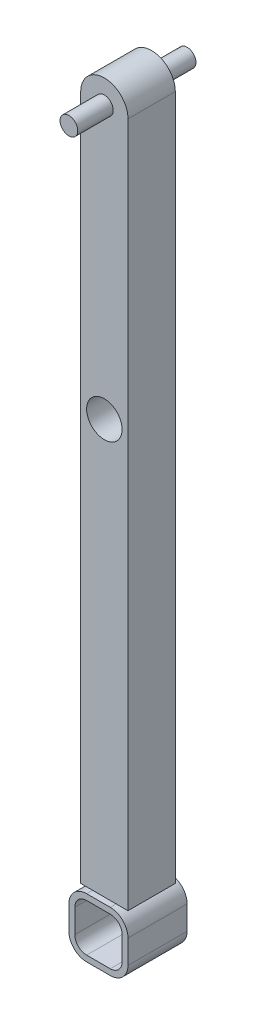
ISO-10303-21;
HEADER;
FILE_DESCRIPTION(('STEP AP214'),'2;1');
FILE_NAME('part.step','',(''),(''),'','','');
FILE_SCHEMA(('AUTOMOTIVE_DESIGN { 1 0 10303 214 1 1 1 1 }'));
ENDSEC;
DATA;
#1=APPLICATION_CONTEXT('core data for automotive mechanical design processes');
#2=APPLICATION_PROTOCOL_DEFINITION('international standard','automotive_design',2000,#1);
#3=PRODUCT_CONTEXT('',#1,'mechanical');
#4=PRODUCT('Part','Part','',(#3));
#5=PRODUCT_RELATED_PRODUCT_CATEGORY('part','',(#4));
#6=PRODUCT_DEFINITION_FORMATION('','',#4);
#7=PRODUCT_DEFINITION_CONTEXT('part definition',#1,'design');
#8=PRODUCT_DEFINITION('design','',#6,#7);
#9=PRODUCT_DEFINITION_SHAPE('','',#8);
#10=(LENGTH_UNIT() NAMED_UNIT(*) SI_UNIT(.MILLI.,.METRE.));
#11=(NAMED_UNIT(*) PLANE_ANGLE_UNIT() SI_UNIT($,.RADIAN.));
#12=(NAMED_UNIT(*) SI_UNIT($,.STERADIAN.) SOLID_ANGLE_UNIT());
#13=UNCERTAINTY_MEASURE_WITH_UNIT(LENGTH_MEASURE(1.E-05),#10,'distance_accuracy_value','');
#14=(GEOMETRIC_REPRESENTATION_CONTEXT(3) GLOBAL_UNCERTAINTY_ASSIGNED_CONTEXT((#13)) GLOBAL_UNIT_ASSIGNED_CONTEXT((#10,
#11,#12)) REPRESENTATION_CONTEXT('',''));
#15=CARTESIAN_POINT('',(0.,0.,0.));
#16=DIRECTION('',(0.,0.,1.));
#17=DIRECTION('',(1.,0.,0.));
#18=AXIS2_PLACEMENT_3D('',#15,#16,#17);
#19=CARTESIAN_POINT('',(0.,605.,5.00000000000001));
#20=DIRECTION('',(0.,0.,-1.));
#21=DIRECTION('',(-1.,0.,0.));
#22=AXIS2_PLACEMENT_3D('',#19,#20,#21);
#23=CYLINDRICAL_SURFACE('',#22,20.);
#24=DIRECTION('',(0.,0.,1.));
#25=VECTOR('',#24,1.);
#26=CARTESIAN_POINT('',(20.,605.,5.));
#27=LINE('',#26,#25);
#28=CARTESIAN_POINT('',(20.,605.,5.));
#29=VERTEX_POINT('',#28);
#30=CARTESIAN_POINT('',(20.,605.,45.));
#31=VERTEX_POINT('',#30);
#32=EDGE_CURVE('E354',#29,#31,#27,.T.);
#33=ORIENTED_EDGE('',*,*,#32,.F.);
#34=CARTESIAN_POINT('',(0.,605.,5.));
#35=DIRECTION('',(0.,0.,1.));
#36=DIRECTION('',(1.,0.,0.));
#37=AXIS2_PLACEMENT_3D('',#34,#35,#36);
#38=CIRCLE('',#37,20.);
#39=CARTESIAN_POINT('',(-20.,605.,5.));
#40=VERTEX_POINT('',#39);
#41=EDGE_CURVE('E52',#40,#29,#38,.F.);
#42=ORIENTED_EDGE('',*,*,#41,.F.);
#43=DIRECTION('',(0.,0.,1.));
#44=VECTOR('',#43,1.);
#45=CARTESIAN_POINT('',(-20.,605.,5.00000000000001));
#46=LINE('',#45,#44);
#47=CARTESIAN_POINT('',(-20.,605.,45.));
#48=VERTEX_POINT('',#47);
#49=EDGE_CURVE('E356',#48,#40,#46,.F.);
#50=ORIENTED_EDGE('',*,*,#49,.F.);
#51=CARTESIAN_POINT('',(0.,605.,45.));
#52=DIRECTION('',(0.,0.,-1.));
#53=DIRECTION('',(-1.,0.,0.));
#54=AXIS2_PLACEMENT_3D('',#51,#52,#53);
#55=CIRCLE('',#54,20.);
#56=EDGE_CURVE('E45',#31,#48,#55,.F.);
#57=ORIENTED_EDGE('',*,*,#56,.F.);
#58=EDGE_LOOP('',(#33,#42,#50,#57));
#59=FACE_BOUND('',#58,.T.);
#60=ADVANCED_FACE('F37',(#59),#23,.T.);
#61=CARTESIAN_POINT('',(-9.99999999999993,25.,50.));
#62=DIRECTION('',(0.,-1.,0.));
#63=DIRECTION('',(0.,0.,-1.));
#64=AXIS2_PLACEMENT_3D('',#61,#62,#63);
#65=PLANE('',#64);
#66=DIRECTION('',(-1.,0.,0.));
#67=VECTOR('',#66,1.);
#68=CARTESIAN_POINT('',(-9.99999999999993,25.,5.));
#69=LINE('',#68,#67);
#70=CARTESIAN_POINT('',(9.99999999999993,25.,5.));
#71=VERTEX_POINT('',#70);
#72=CARTESIAN_POINT('',(-9.99999999999993,25.,5.));
#73=VERTEX_POINT('',#72);
#74=EDGE_CURVE('E352',#71,#73,#69,.T.);
#75=ORIENTED_EDGE('',*,*,#74,.F.);
#76=DIRECTION('',(0.,0.,-1.));
#77=VECTOR('',#76,1.);
#78=CARTESIAN_POINT('',(9.99999999999993,25.,50.));
#79=LINE('',#78,#77);
#80=CARTESIAN_POINT('',(9.99999999999993,25.,0.));
#81=VERTEX_POINT('',#80);
#82=EDGE_CURVE('E327',#71,#81,#79,.T.);
#83=ORIENTED_EDGE('',*,*,#82,.T.);
#84=DIRECTION('',(-1.,0.,0.));
#85=VECTOR('',#84,1.);
#86=CARTESIAN_POINT('',(-9.99999999999993,25.,0.));
#87=LINE('',#86,#85);
#88=CARTESIAN_POINT('',(-9.99999999999993,25.,0.));
#89=VERTEX_POINT('',#88);
#90=EDGE_CURVE('E292',#81,#89,#87,.T.);
#91=ORIENTED_EDGE('',*,*,#90,.T.);
#92=DIRECTION('',(0.,0.,-1.));
#93=VECTOR('',#92,1.);
#94=CARTESIAN_POINT('',(-9.99999999999993,25.,50.));
#95=LINE('',#94,#93);
#96=EDGE_CURVE('E306',#73,#89,#95,.T.);
#97=ORIENTED_EDGE('',*,*,#96,.F.);
#98=EDGE_LOOP('',(#75,#83,#91,#97));
#99=FACE_BOUND('',#98,.T.);
#100=ADVANCED_FACE('F389',(#99),#65,.F.);
#101=DIRECTION('',(1.,0.,0.));
#102=VECTOR('',#101,1.);
#103=CARTESIAN_POINT('',(-9.99999999999993,25.,45.));
#104=LINE('',#103,#102);
#105=CARTESIAN_POINT('',(-9.99999999999993,25.,45.));
#106=VERTEX_POINT('',#105);
#107=CARTESIAN_POINT('',(9.99999999999993,25.,45.));
#108=VERTEX_POINT('',#107);
#109=EDGE_CURVE('E349',#106,#108,#104,.T.);
#110=ORIENTED_EDGE('',*,*,#109,.F.);
#111=CARTESIAN_POINT('',(-9.99999999999993,25.,50.));
#112=VERTEX_POINT('',#111);
#113=EDGE_CURVE('E324',#112,#106,#95,.T.);
#114=ORIENTED_EDGE('',*,*,#113,.F.);
#115=DIRECTION('',(-1.,0.,0.));
#116=VECTOR('',#115,1.);
#117=CARTESIAN_POINT('',(-9.99999999999993,25.,50.));
#118=LINE('',#117,#116);
#119=CARTESIAN_POINT('',(9.99999999999993,25.,50.));
#120=VERTEX_POINT('',#119);
#121=EDGE_CURVE('E304',#120,#112,#118,.T.);
#122=ORIENTED_EDGE('',*,*,#121,.F.);
#123=EDGE_CURVE('E329',#120,#108,#79,.T.);
#124=ORIENTED_EDGE('',*,*,#123,.T.);
#125=EDGE_LOOP('',(#110,#114,#122,#124));
#126=FACE_BOUND('',#125,.T.);
#127=ADVANCED_FACE('F371',(#126),#65,.F.);
#128=CARTESIAN_POINT('',(-10.,10.,50.));
#129=DIRECTION('',(0.,0.,1.));
#130=DIRECTION('',(1.,0.,0.));
#131=AXIS2_PLACEMENT_3D('',#128,#129,#130);
#132=PLANE('',#131);
#133=CARTESIAN_POINT('',(-10.,10.,50.));
#134=DIRECTION('',(0.,0.,1.));
#135=DIRECTION('',(1.,0.,0.));
#136=AXIS2_PLACEMENT_3D('',#133,#134,#135);
#137=CIRCLE('',#136,15.);
#138=CARTESIAN_POINT('',(-25.,9.99999999999993,50.));
#139=VERTEX_POINT('',#138);
#140=EDGE_CURVE('E288',#112,#139,#137,.T.);
#141=ORIENTED_EDGE('',*,*,#140,.T.);
#142=DIRECTION('',(0.,-1.,0.));
#143=VECTOR('',#142,1.);
#144=CARTESIAN_POINT('',(-25.,9.99999999999993,50.));
#145=LINE('',#144,#143);
#146=CARTESIAN_POINT('',(-25.,-9.9999999999999,50.));
#147=VERTEX_POINT('',#146);
#148=EDGE_CURVE('E291',#139,#147,#145,.T.);
#149=ORIENTED_EDGE('',*,*,#148,.T.);
#150=CARTESIAN_POINT('',(-10.,-10.,50.));
#151=DIRECTION('',(0.,0.,1.));
#152=DIRECTION('',(1.,0.,0.));
#153=AXIS2_PLACEMENT_3D('',#150,#151,#152);
#154=CIRCLE('',#153,15.);
#155=CARTESIAN_POINT('',(-9.99999999999993,-25.,50.));
#156=VERTEX_POINT('',#155);
#157=EDGE_CURVE('E294',#147,#156,#154,.T.);
#158=ORIENTED_EDGE('',*,*,#157,.T.);
#159=DIRECTION('',(1.,0.,0.));
#160=VECTOR('',#159,1.);
#161=CARTESIAN_POINT('',(-9.99999999999993,-25.,50.));
#162=LINE('',#161,#160);
#163=CARTESIAN_POINT('',(9.9999999999999,-25.,50.));
#164=VERTEX_POINT('',#163);
#165=EDGE_CURVE('E296',#156,#164,#162,.T.);
#166=ORIENTED_EDGE('',*,*,#165,.T.);
#167=CARTESIAN_POINT('',(10.,-10.,50.));
#168=DIRECTION('',(0.,0.,1.));
#169=DIRECTION('',(1.,0.,0.));
#170=AXIS2_PLACEMENT_3D('',#167,#168,#169);
#171=CIRCLE('',#170,15.);
#172=CARTESIAN_POINT('',(25.,-9.99999999999993,50.));
#173=VERTEX_POINT('',#172);
#174=EDGE_CURVE('E298',#164,#173,#171,.T.);
#175=ORIENTED_EDGE('',*,*,#174,.T.);
#176=DIRECTION('',(0.,1.,0.));
#177=VECTOR('',#176,1.);
#178=CARTESIAN_POINT('',(25.,9.99999999999989,50.));
#179=LINE('',#178,#177);
#180=CARTESIAN_POINT('',(25.,9.9999999999999,50.));
#181=VERTEX_POINT('',#180);
#182=EDGE_CURVE('E300',#173,#181,#179,.T.);
#183=ORIENTED_EDGE('',*,*,#182,.T.);
#184=CARTESIAN_POINT('',(10.,10.,50.));
#185=DIRECTION('',(0.,0.,1.));
#186=DIRECTION('',(-1.,0.,0.));
#187=AXIS2_PLACEMENT_3D('',#184,#185,#186);
#188=CIRCLE('',#187,15.);
#189=EDGE_CURVE('E302',#181,#120,#188,.T.);
#190=ORIENTED_EDGE('',*,*,#189,.T.);
#191=ORIENTED_EDGE('',*,*,#121,.T.);
#192=EDGE_LOOP('',(#141,#149,#158,#166,#175,#183,#190,#191));
#193=FACE_BOUND('',#192,.T.);
#194=DIRECTION('',(1.,0.,0.));
#195=VECTOR('',#194,1.);
#196=CARTESIAN_POINT('',(-9.99999999999993,-20.,50.));
#197=LINE('',#196,#195);
#198=CARTESIAN_POINT('',(-9.99999999999993,-20.,50.));
#199=VERTEX_POINT('',#198);
#200=CARTESIAN_POINT('',(9.99999999999994,-20.,50.));
#201=VERTEX_POINT('',#200);
#202=EDGE_CURVE('E231',#199,#201,#197,.T.);
#203=ORIENTED_EDGE('',*,*,#202,.F.);
#204=CARTESIAN_POINT('',(-10.,-10.,50.));
#205=DIRECTION('',(0.,0.,1.));
#206=DIRECTION('',(1.,0.,0.));
#207=AXIS2_PLACEMENT_3D('',#204,#205,#206);
#208=CIRCLE('',#207,10.);
#209=CARTESIAN_POINT('',(-20.,-9.99999999999993,50.));
#210=VERTEX_POINT('',#209);
#211=EDGE_CURVE('E229',#210,#199,#208,.T.);
#212=ORIENTED_EDGE('',*,*,#211,.F.);
#213=DIRECTION('',(0.,-1.,0.));
#214=VECTOR('',#213,1.);
#215=CARTESIAN_POINT('',(-20.,9.99999999999993,50.));
#216=LINE('',#215,#214);
#217=CARTESIAN_POINT('',(-20.,9.99999999999993,50.));
#218=VERTEX_POINT('',#217);
#219=EDGE_CURVE('E245',#218,#210,#216,.T.);
#220=ORIENTED_EDGE('',*,*,#219,.F.);
#221=CARTESIAN_POINT('',(-10.,10.,50.));
#222=DIRECTION('',(0.,0.,1.));
#223=DIRECTION('',(1.,0.,0.));
#224=AXIS2_PLACEMENT_3D('',#221,#222,#223);
#225=CIRCLE('',#224,10.);
#226=CARTESIAN_POINT('',(-9.99999999999993,20.,50.));
#227=VERTEX_POINT('',#226);
#228=EDGE_CURVE('E242',#227,#218,#225,.T.);
#229=ORIENTED_EDGE('',*,*,#228,.F.);
#230=DIRECTION('',(-1.,0.,0.));
#231=VECTOR('',#230,1.);
#232=CARTESIAN_POINT('',(-9.99999999999993,20.,50.));
#233=LINE('',#232,#231);
#234=CARTESIAN_POINT('',(9.99999999999993,20.,50.));
#235=VERTEX_POINT('',#234);
#236=EDGE_CURVE('E240',#235,#227,#233,.T.);
#237=ORIENTED_EDGE('',*,*,#236,.F.);
#238=CARTESIAN_POINT('',(10.,10.,50.));
#239=DIRECTION('',(0.,0.,1.));
#240=DIRECTION('',(-1.,0.,0.));
#241=AXIS2_PLACEMENT_3D('',#238,#239,#240);
#242=CIRCLE('',#241,10.);
#243=CARTESIAN_POINT('',(20.,9.99999999999993,50.));
#244=VERTEX_POINT('',#243);
#245=EDGE_CURVE('E238',#244,#235,#242,.T.);
#246=ORIENTED_EDGE('',*,*,#245,.F.);
#247=DIRECTION('',(0.,1.,0.));
#248=VECTOR('',#247,1.);
#249=CARTESIAN_POINT('',(20.,9.99999999999993,50.));
#250=LINE('',#249,#248);
#251=CARTESIAN_POINT('',(20.,-9.99999999999993,50.));
#252=VERTEX_POINT('',#251);
#253=EDGE_CURVE('E236',#252,#244,#250,.T.);
#254=ORIENTED_EDGE('',*,*,#253,.F.);
#255=CARTESIAN_POINT('',(10.,-10.,50.));
#256=DIRECTION('',(0.,0.,1.));
#257=DIRECTION('',(1.,0.,0.));
#258=AXIS2_PLACEMENT_3D('',#255,#256,#257);
#259=CIRCLE('',#258,10.);
#260=EDGE_CURVE('E234',#201,#252,#259,.T.);
#261=ORIENTED_EDGE('',*,*,#260,.F.);
#262=EDGE_LOOP('',(#203,#212,#220,#229,#237,#246,#254,#261));
#263=FACE_BOUND('',#262,.T.);
#264=ADVANCED_FACE('F379',(#193,#263),#132,.T.);
#265=CARTESIAN_POINT('',(-10.,10.,0.));
#266=DIRECTION('',(0.,0.,1.));
#267=DIRECTION('',(1.,0.,0.));
#268=AXIS2_PLACEMENT_3D('',#265,#266,#267);
#269=PLANE('',#268);
#270=CARTESIAN_POINT('',(-10.,10.,0.));
#271=DIRECTION('',(0.,0.,1.));
#272=DIRECTION('',(1.,0.,0.));
#273=AXIS2_PLACEMENT_3D('',#270,#271,#272);
#274=CIRCLE('',#273,15.);
#275=CARTESIAN_POINT('',(-25.,9.99999999999993,0.));
#276=VERTEX_POINT('',#275);
#277=EDGE_CURVE('E287',#89,#276,#274,.T.);
#278=ORIENTED_EDGE('',*,*,#277,.F.);
#279=ORIENTED_EDGE('',*,*,#90,.F.);
#280=CARTESIAN_POINT('',(10.,10.,0.));
#281=DIRECTION('',(0.,0.,1.));
#282=DIRECTION('',(-1.,0.,0.));
#283=AXIS2_PLACEMENT_3D('',#280,#281,#282);
#284=CIRCLE('',#283,15.);
#285=CARTESIAN_POINT('',(25.,9.9999999999999,0.));
#286=VERTEX_POINT('',#285);
#287=EDGE_CURVE('E319',#286,#81,#284,.T.);
#288=ORIENTED_EDGE('',*,*,#287,.F.);
#289=DIRECTION('',(0.,1.,0.));
#290=VECTOR('',#289,1.);
#291=CARTESIAN_POINT('',(25.,9.99999999999989,0.));
#292=LINE('',#291,#290);
#293=CARTESIAN_POINT('',(25.,-9.99999999999993,0.));
#294=VERTEX_POINT('',#293);
#295=EDGE_CURVE('E317',#294,#286,#292,.T.);
#296=ORIENTED_EDGE('',*,*,#295,.F.);
#297=CARTESIAN_POINT('',(10.,-10.,0.));
#298=DIRECTION('',(0.,0.,1.));
#299=DIRECTION('',(1.,0.,0.));
#300=AXIS2_PLACEMENT_3D('',#297,#298,#299);
#301=CIRCLE('',#300,15.);
#302=CARTESIAN_POINT('',(9.9999999999999,-25.,0.));
#303=VERTEX_POINT('',#302);
#304=EDGE_CURVE('E315',#303,#294,#301,.T.);
#305=ORIENTED_EDGE('',*,*,#304,.F.);
#306=DIRECTION('',(1.,0.,0.));
#307=VECTOR('',#306,1.);
#308=CARTESIAN_POINT('',(-9.99999999999993,-25.,0.));
#309=LINE('',#308,#307);
#310=CARTESIAN_POINT('',(-9.99999999999993,-25.,0.));
#311=VERTEX_POINT('',#310);
#312=EDGE_CURVE('E313',#311,#303,#309,.T.);
#313=ORIENTED_EDGE('',*,*,#312,.F.);
#314=CARTESIAN_POINT('',(-10.,-10.,0.));
#315=DIRECTION('',(0.,0.,1.));
#316=DIRECTION('',(1.,0.,0.));
#317=AXIS2_PLACEMENT_3D('',#314,#315,#316);
#318=CIRCLE('',#317,15.);
#319=CARTESIAN_POINT('',(-25.,-9.9999999999999,0.));
#320=VERTEX_POINT('',#319);
#321=EDGE_CURVE('E311',#320,#311,#318,.T.);
#322=ORIENTED_EDGE('',*,*,#321,.F.);
#323=DIRECTION('',(0.,-1.,0.));
#324=VECTOR('',#323,1.);
#325=CARTESIAN_POINT('',(-25.,9.99999999999993,0.));
#326=LINE('',#325,#324);
#327=EDGE_CURVE('E309',#276,#320,#326,.T.);
#328=ORIENTED_EDGE('',*,*,#327,.F.);
#329=EDGE_LOOP('',(#278,#279,#288,#296,#305,#313,#322,#328));
#330=FACE_BOUND('',#329,.T.);
#331=CARTESIAN_POINT('',(-10.,-10.,0.));
#332=DIRECTION('',(0.,0.,1.));
#333=DIRECTION('',(1.,0.,0.));
#334=AXIS2_PLACEMENT_3D('',#331,#332,#333);
#335=CIRCLE('',#334,10.);
#336=CARTESIAN_POINT('',(-20.,-9.99999999999993,0.));
#337=VERTEX_POINT('',#336);
#338=CARTESIAN_POINT('',(-9.99999999999993,-20.,0.));
#339=VERTEX_POINT('',#338);
#340=EDGE_CURVE('E194',#337,#339,#335,.T.);
#341=ORIENTED_EDGE('',*,*,#340,.T.);
#342=DIRECTION('',(1.,0.,0.));
#343=VECTOR('',#342,1.);
#344=CARTESIAN_POINT('',(-9.99999999999993,-20.,0.));
#345=LINE('',#344,#343);
#346=CARTESIAN_POINT('',(9.99999999999994,-20.,0.));
#347=VERTEX_POINT('',#346);
#348=EDGE_CURVE('E250',#339,#347,#345,.T.);
#349=ORIENTED_EDGE('',*,*,#348,.T.);
#350=CARTESIAN_POINT('',(10.,-10.,0.));
#351=DIRECTION('',(0.,0.,1.));
#352=DIRECTION('',(1.,0.,0.));
#353=AXIS2_PLACEMENT_3D('',#350,#351,#352);
#354=CIRCLE('',#353,10.);
#355=CARTESIAN_POINT('',(20.,-9.99999999999993,0.));
#356=VERTEX_POINT('',#355);
#357=EDGE_CURVE('E253',#347,#356,#354,.T.);
#358=ORIENTED_EDGE('',*,*,#357,.T.);
#359=DIRECTION('',(0.,1.,0.));
#360=VECTOR('',#359,1.);
#361=CARTESIAN_POINT('',(20.,9.99999999999993,0.));
#362=LINE('',#361,#360);
#363=CARTESIAN_POINT('',(20.,9.99999999999993,0.));
#364=VERTEX_POINT('',#363);
#365=EDGE_CURVE('E256',#356,#364,#362,.T.);
#366=ORIENTED_EDGE('',*,*,#365,.T.);
#367=CARTESIAN_POINT('',(10.,10.,0.));
#368=DIRECTION('',(0.,0.,1.));
#369=DIRECTION('',(-1.,0.,0.));
#370=AXIS2_PLACEMENT_3D('',#367,#368,#369);
#371=CIRCLE('',#370,10.);
#372=CARTESIAN_POINT('',(9.99999999999993,20.,0.));
#373=VERTEX_POINT('',#372);
#374=EDGE_CURVE('E259',#364,#373,#371,.T.);
#375=ORIENTED_EDGE('',*,*,#374,.T.);
#376=DIRECTION('',(-1.,0.,0.));
#377=VECTOR('',#376,1.);
#378=CARTESIAN_POINT('',(-9.99999999999993,20.,0.));
#379=LINE('',#378,#377);
#380=CARTESIAN_POINT('',(-9.99999999999993,20.,0.));
#381=VERTEX_POINT('',#380);
#382=EDGE_CURVE('E262',#373,#381,#379,.T.);
#383=ORIENTED_EDGE('',*,*,#382,.T.);
#384=CARTESIAN_POINT('',(-10.,10.,0.));
#385=DIRECTION('',(0.,0.,1.));
#386=DIRECTION('',(1.,0.,0.));
#387=AXIS2_PLACEMENT_3D('',#384,#385,#386);
#388=CIRCLE('',#387,10.);
#389=CARTESIAN_POINT('',(-20.,9.99999999999993,0.));
#390=VERTEX_POINT('',#389);
#391=EDGE_CURVE('E265',#381,#390,#388,.T.);
#392=ORIENTED_EDGE('',*,*,#391,.T.);
#393=DIRECTION('',(0.,-1.,0.));
#394=VECTOR('',#393,1.);
#395=CARTESIAN_POINT('',(-20.,9.99999999999993,0.));
#396=LINE('',#395,#394);
#397=EDGE_CURVE('E232',#390,#337,#396,.T.);
#398=ORIENTED_EDGE('',*,*,#397,.T.);
#399=EDGE_LOOP('',(#341,#349,#358,#366,#375,#383,#392,#398));
#400=FACE_BOUND('',#399,.T.);
#401=ADVANCED_FACE('F395',(#330,#400),#269,.F.);
#402=CARTESIAN_POINT('',(-10.,10.,50.));
#403=DIRECTION('',(0.,0.,-1.));
#404=DIRECTION('',(-1.,0.,0.));
#405=AXIS2_PLACEMENT_3D('',#402,#403,#404);
#406=CYLINDRICAL_SURFACE('',#405,15.);
#407=ORIENTED_EDGE('',*,*,#277,.T.);
#408=DIRECTION('',(0.,0.,-1.));
#409=VECTOR('',#408,1.);
#410=CARTESIAN_POINT('',(-25.,9.99999999999993,50.));
#411=LINE('',#410,#409);
#412=EDGE_CURVE('E346',#139,#276,#411,.T.);
#413=ORIENTED_EDGE('',*,*,#412,.F.);
#414=ORIENTED_EDGE('',*,*,#140,.F.);
#415=ORIENTED_EDGE('',*,*,#113,.T.);
#416=EDGE_CURVE('E328',#106,#73,#95,.T.);
#417=ORIENTED_EDGE('',*,*,#416,.T.);
#418=ORIENTED_EDGE('',*,*,#96,.T.);
#419=EDGE_LOOP('',(#407,#413,#414,#415,#417,#418));
#420=FACE_BOUND('',#419,.T.);
#421=ADVANCED_FACE('F376',(#420),#406,.T.);
#422=CARTESIAN_POINT('',(-25.,9.99999999999993,50.));
#423=DIRECTION('',(1.,0.,0.));
#424=DIRECTION('',(0.,1.,0.));
#425=AXIS2_PLACEMENT_3D('',#422,#423,#424);
#426=PLANE('',#425);
#427=ORIENTED_EDGE('',*,*,#327,.T.);
#428=DIRECTION('',(0.,0.,-1.));
#429=VECTOR('',#428,1.);
#430=CARTESIAN_POINT('',(-25.,-9.9999999999999,50.));
#431=LINE('',#430,#429);
#432=EDGE_CURVE('E343',#147,#320,#431,.T.);
#433=ORIENTED_EDGE('',*,*,#432,.F.);
#434=ORIENTED_EDGE('',*,*,#148,.F.);
#435=ORIENTED_EDGE('',*,*,#412,.T.);
#436=EDGE_LOOP('',(#427,#433,#434,#435));
#437=FACE_BOUND('',#436,.T.);
#438=ADVANCED_FACE('F400',(#437),#426,.F.);
#439=CARTESIAN_POINT('',(-10.,-10.,50.));
#440=DIRECTION('',(0.,0.,-1.));
#441=DIRECTION('',(-1.,0.,0.));
#442=AXIS2_PLACEMENT_3D('',#439,#440,#441);
#443=CYLINDRICAL_SURFACE('',#442,15.);
#444=ORIENTED_EDGE('',*,*,#321,.T.);
#445=DIRECTION('',(0.,0.,-1.));
#446=VECTOR('',#445,1.);
#447=CARTESIAN_POINT('',(-9.99999999999993,-25.,50.));
#448=LINE('',#447,#446);
#449=EDGE_CURVE('E340',#156,#311,#448,.T.);
#450=ORIENTED_EDGE('',*,*,#449,.F.);
#451=ORIENTED_EDGE('',*,*,#157,.F.);
#452=ORIENTED_EDGE('',*,*,#432,.T.);
#453=EDGE_LOOP('',(#444,#450,#451,#452));
#454=FACE_BOUND('',#453,.T.);
#455=ADVANCED_FACE('F404',(#454),#443,.T.);
#456=CARTESIAN_POINT('',(-9.99999999999993,-25.,50.));
#457=DIRECTION('',(0.,1.,0.));
#458=DIRECTION('',(-1.,0.,0.));
#459=AXIS2_PLACEMENT_3D('',#456,#457,#458);
#460=PLANE('',#459);
#461=ORIENTED_EDGE('',*,*,#312,.T.);
#462=DIRECTION('',(0.,0.,-1.));
#463=VECTOR('',#462,1.);
#464=CARTESIAN_POINT('',(9.9999999999999,-25.,50.));
#465=LINE('',#464,#463);
#466=EDGE_CURVE('E337',#164,#303,#465,.T.);
#467=ORIENTED_EDGE('',*,*,#466,.F.);
#468=ORIENTED_EDGE('',*,*,#165,.F.);
#469=ORIENTED_EDGE('',*,*,#449,.T.);
#470=EDGE_LOOP('',(#461,#467,#468,#469));
#471=FACE_BOUND('',#470,.T.);
#472=ADVANCED_FACE('F410',(#471),#460,.F.);
#473=CARTESIAN_POINT('',(10.,-10.,50.));
#474=DIRECTION('',(0.,0.,-1.));
#475=DIRECTION('',(-1.,0.,0.));
#476=AXIS2_PLACEMENT_3D('',#473,#474,#475);
#477=CYLINDRICAL_SURFACE('',#476,15.);
#478=ORIENTED_EDGE('',*,*,#304,.T.);
#479=DIRECTION('',(0.,0.,-1.));
#480=VECTOR('',#479,1.);
#481=CARTESIAN_POINT('',(25.,-9.99999999999993,50.));
#482=LINE('',#481,#480);
#483=EDGE_CURVE('E334',#173,#294,#482,.T.);
#484=ORIENTED_EDGE('',*,*,#483,.F.);
#485=ORIENTED_EDGE('',*,*,#174,.F.);
#486=ORIENTED_EDGE('',*,*,#466,.T.);
#487=EDGE_LOOP('',(#478,#484,#485,#486));
#488=FACE_BOUND('',#487,.T.);
#489=ADVANCED_FACE('F413',(#488),#477,.T.);
#490=CARTESIAN_POINT('',(25.,9.99999999999989,50.));
#491=DIRECTION('',(-1.,0.,0.));
#492=DIRECTION('',(0.,0.,1.));
#493=AXIS2_PLACEMENT_3D('',#490,#491,#492);
#494=PLANE('',#493);
#495=ORIENTED_EDGE('',*,*,#295,.T.);
#496=DIRECTION('',(0.,0.,-1.));
#497=VECTOR('',#496,1.);
#498=CARTESIAN_POINT('',(25.,9.9999999999999,50.));
#499=LINE('',#498,#497);
#500=EDGE_CURVE('E331',#181,#286,#499,.T.);
#501=ORIENTED_EDGE('',*,*,#500,.F.);
#502=ORIENTED_EDGE('',*,*,#182,.F.);
#503=ORIENTED_EDGE('',*,*,#483,.T.);
#504=EDGE_LOOP('',(#495,#501,#502,#503));
#505=FACE_BOUND('',#504,.T.);
#506=ADVANCED_FACE('F415',(#505),#494,.F.);
#507=CARTESIAN_POINT('',(10.,10.,50.));
#508=DIRECTION('',(0.,0.,-1.));
#509=DIRECTION('',(-1.,0.,0.));
#510=AXIS2_PLACEMENT_3D('',#507,#508,#509);
#511=CYLINDRICAL_SURFACE('',#510,15.);
#512=ORIENTED_EDGE('',*,*,#287,.T.);
#513=ORIENTED_EDGE('',*,*,#82,.F.);
#514=EDGE_CURVE('E204',#108,#71,#79,.T.);
#515=ORIENTED_EDGE('',*,*,#514,.F.);
#516=ORIENTED_EDGE('',*,*,#123,.F.);
#517=ORIENTED_EDGE('',*,*,#189,.F.);
#518=ORIENTED_EDGE('',*,*,#500,.T.);
#519=EDGE_LOOP('',(#512,#513,#515,#516,#517,#518));
#520=FACE_BOUND('',#519,.T.);
#521=ADVANCED_FACE('F386',(#520),#511,.T.);
#522=CARTESIAN_POINT('',(-10.,-10.,50.));
#523=DIRECTION('',(0.,0.,-1.));
#524=DIRECTION('',(-1.,0.,0.));
#525=AXIS2_PLACEMENT_3D('',#522,#523,#524);
#526=CYLINDRICAL_SURFACE('',#525,10.);
#527=ORIENTED_EDGE('',*,*,#340,.F.);
#528=DIRECTION('',(0.,0.,-1.));
#529=VECTOR('',#528,1.);
#530=CARTESIAN_POINT('',(-20.,-9.99999999999993,50.));
#531=LINE('',#530,#529);
#532=EDGE_CURVE('E247',#210,#337,#531,.T.);
#533=ORIENTED_EDGE('',*,*,#532,.F.);
#534=ORIENTED_EDGE('',*,*,#211,.T.);
#535=DIRECTION('',(0.,0.,-1.));
#536=VECTOR('',#535,1.);
#537=CARTESIAN_POINT('',(-9.99999999999993,-20.,50.));
#538=LINE('',#537,#536);
#539=EDGE_CURVE('E284',#199,#339,#538,.T.);
#540=ORIENTED_EDGE('',*,*,#539,.T.);
#541=EDGE_LOOP('',(#527,#533,#534,#540));
#542=FACE_BOUND('',#541,.T.);
#543=ADVANCED_FACE('F422',(#542),#526,.F.);
#544=CARTESIAN_POINT('',(-9.99999999999993,-20.,50.));
#545=DIRECTION('',(0.,1.,0.));
#546=DIRECTION('',(0.,0.,1.));
#547=AXIS2_PLACEMENT_3D('',#544,#545,#546);
#548=PLANE('',#547);
#549=ORIENTED_EDGE('',*,*,#348,.F.);
#550=ORIENTED_EDGE('',*,*,#539,.F.);
#551=ORIENTED_EDGE('',*,*,#202,.T.);
#552=DIRECTION('',(0.,0.,-1.));
#553=VECTOR('',#552,1.);
#554=CARTESIAN_POINT('',(9.99999999999994,-20.,50.));
#555=LINE('',#554,#553);
#556=EDGE_CURVE('E282',#201,#347,#555,.T.);
#557=ORIENTED_EDGE('',*,*,#556,.T.);
#558=EDGE_LOOP('',(#549,#550,#551,#557));
#559=FACE_BOUND('',#558,.T.);
#560=ADVANCED_FACE('F440',(#559),#548,.T.);
#561=CARTESIAN_POINT('',(10.,-10.,50.));
#562=DIRECTION('',(0.,0.,-1.));
#563=DIRECTION('',(-1.,0.,0.));
#564=AXIS2_PLACEMENT_3D('',#561,#562,#563);
#565=CYLINDRICAL_SURFACE('',#564,10.);
#566=ORIENTED_EDGE('',*,*,#357,.F.);
#567=ORIENTED_EDGE('',*,*,#556,.F.);
#568=ORIENTED_EDGE('',*,*,#260,.T.);
#569=DIRECTION('',(0.,0.,-1.));
#570=VECTOR('',#569,1.);
#571=CARTESIAN_POINT('',(20.,-9.99999999999993,50.));
#572=LINE('',#571,#570);
#573=EDGE_CURVE('E280',#252,#356,#572,.T.);
#574=ORIENTED_EDGE('',*,*,#573,.T.);
#575=EDGE_LOOP('',(#566,#567,#568,#574));
#576=FACE_BOUND('',#575,.T.);
#577=ADVANCED_FACE('F444',(#576),#565,.F.);
#578=CARTESIAN_POINT('',(20.,9.99999999999993,50.));
#579=DIRECTION('',(-1.,0.,0.));
#580=DIRECTION('',(0.,-1.,0.));
#581=AXIS2_PLACEMENT_3D('',#578,#579,#580);
#582=PLANE('',#581);
#583=ORIENTED_EDGE('',*,*,#365,.F.);
#584=ORIENTED_EDGE('',*,*,#573,.F.);
#585=ORIENTED_EDGE('',*,*,#253,.T.);
#586=DIRECTION('',(0.,0.,-1.));
#587=VECTOR('',#586,1.);
#588=CARTESIAN_POINT('',(20.,9.99999999999993,50.));
#589=LINE('',#588,#587);
#590=EDGE_CURVE('E278',#244,#364,#589,.T.);
#591=ORIENTED_EDGE('',*,*,#590,.T.);
#592=EDGE_LOOP('',(#583,#584,#585,#591));
#593=FACE_BOUND('',#592,.T.);
#594=ADVANCED_FACE('F448',(#593),#582,.T.);
#595=CARTESIAN_POINT('',(10.,10.,50.));
#596=DIRECTION('',(0.,0.,-1.));
#597=DIRECTION('',(-1.,0.,0.));
#598=AXIS2_PLACEMENT_3D('',#595,#596,#597);
#599=CYLINDRICAL_SURFACE('',#598,10.);
#600=ORIENTED_EDGE('',*,*,#374,.F.);
#601=ORIENTED_EDGE('',*,*,#590,.F.);
#602=ORIENTED_EDGE('',*,*,#245,.T.);
#603=DIRECTION('',(0.,0.,-1.));
#604=VECTOR('',#603,1.);
#605=CARTESIAN_POINT('',(9.99999999999993,20.,50.));
#606=LINE('',#605,#604);
#607=EDGE_CURVE('E276',#235,#373,#606,.T.);
#608=ORIENTED_EDGE('',*,*,#607,.T.);
#609=EDGE_LOOP('',(#600,#601,#602,#608));
#610=FACE_BOUND('',#609,.T.);
#611=ADVANCED_FACE('F452',(#610),#599,.F.);
#612=CARTESIAN_POINT('',(-9.99999999999993,20.,50.));
#613=DIRECTION('',(0.,-1.,0.));
#614=DIRECTION('',(0.,0.,-1.));
#615=AXIS2_PLACEMENT_3D('',#612,#613,#614);
#616=PLANE('',#615);
#617=ORIENTED_EDGE('',*,*,#382,.F.);
#618=ORIENTED_EDGE('',*,*,#607,.F.);
#619=ORIENTED_EDGE('',*,*,#236,.T.);
#620=DIRECTION('',(0.,0.,-1.));
#621=VECTOR('',#620,1.);
#622=CARTESIAN_POINT('',(-9.99999999999993,20.,50.));
#623=LINE('',#622,#621);
#624=EDGE_CURVE('E274',#227,#381,#623,.T.);
#625=ORIENTED_EDGE('',*,*,#624,.T.);
#626=EDGE_LOOP('',(#617,#618,#619,#625));
#627=FACE_BOUND('',#626,.T.);
#628=ADVANCED_FACE('F456',(#627),#616,.T.);
#629=CARTESIAN_POINT('',(-10.,10.,50.));
#630=DIRECTION('',(0.,0.,-1.));
#631=DIRECTION('',(-1.,0.,0.));
#632=AXIS2_PLACEMENT_3D('',#629,#630,#631);
#633=CYLINDRICAL_SURFACE('',#632,10.);
#634=ORIENTED_EDGE('',*,*,#391,.F.);
#635=ORIENTED_EDGE('',*,*,#624,.F.);
#636=ORIENTED_EDGE('',*,*,#228,.T.);
#637=DIRECTION('',(0.,0.,-1.));
#638=VECTOR('',#637,1.);
#639=CARTESIAN_POINT('',(-20.,9.99999999999993,50.));
#640=LINE('',#639,#638);
#641=EDGE_CURVE('E272',#218,#390,#640,.T.);
#642=ORIENTED_EDGE('',*,*,#641,.T.);
#643=EDGE_LOOP('',(#634,#635,#636,#642));
#644=FACE_BOUND('',#643,.T.);
#645=ADVANCED_FACE('F460',(#644),#633,.F.);
#646=CARTESIAN_POINT('',(-20.,9.99999999999993,50.));
#647=DIRECTION('',(1.,0.,0.));
#648=DIRECTION('',(0.,0.,-1.));
#649=AXIS2_PLACEMENT_3D('',#646,#647,#648);
#650=PLANE('',#649);
#651=ORIENTED_EDGE('',*,*,#397,.F.);
#652=ORIENTED_EDGE('',*,*,#641,.F.);
#653=ORIENTED_EDGE('',*,*,#219,.T.);
#654=ORIENTED_EDGE('',*,*,#532,.T.);
#655=EDGE_LOOP('',(#651,#652,#653,#654));
#656=FACE_BOUND('',#655,.T.);
#657=ADVANCED_FACE('F464',(#656),#650,.T.);
#658=CARTESIAN_POINT('',(0.,25.,0.));
#659=DIRECTION('',(0.,1.,0.));
#660=DIRECTION('',(0.,0.,1.));
#661=AXIS2_PLACEMENT_3D('',#658,#659,#660);
#662=PLANE('',#661);
#663=DIRECTION('',(1.,0.,0.));
#664=VECTOR('',#663,1.);
#665=CARTESIAN_POINT('',(-20.,25.,45.));
#666=LINE('',#665,#664);
#667=CARTESIAN_POINT('',(20.,25.,45.));
#668=VERTEX_POINT('',#667);
#669=EDGE_CURVE('E221',#108,#668,#666,.T.);
#670=ORIENTED_EDGE('',*,*,#669,.F.);
#671=ORIENTED_EDGE('',*,*,#514,.T.);
#672=DIRECTION('',(-1.,0.,0.));
#673=VECTOR('',#672,1.);
#674=CARTESIAN_POINT('',(-20.,25.,5.));
#675=LINE('',#674,#673);
#676=CARTESIAN_POINT('',(20.,25.,5.));
#677=VERTEX_POINT('',#676);
#678=EDGE_CURVE('E190',#677,#71,#675,.T.);
#679=ORIENTED_EDGE('',*,*,#678,.F.);
#680=DIRECTION('',(0.,0.,-1.));
#681=VECTOR('',#680,1.);
#682=CARTESIAN_POINT('',(20.,25.,5.));
#683=LINE('',#682,#681);
#684=EDGE_CURVE('E202',#668,#677,#683,.T.);
#685=ORIENTED_EDGE('',*,*,#684,.F.);
#686=EDGE_LOOP('',(#670,#671,#679,#685));
#687=FACE_BOUND('',#686,.T.);
#688=ADVANCED_FACE('F201',(#687),#662,.F.);
#689=CARTESIAN_POINT('',(20.,625.,5.));
#690=DIRECTION('',(-1.,0.,0.));
#691=DIRECTION('',(0.,0.,1.));
#692=AXIS2_PLACEMENT_3D('',#689,#690,#691);
#693=PLANE('',#692);
#694=DIRECTION('',(0.,-1.,0.));
#695=VECTOR('',#694,1.);
#696=CARTESIAN_POINT('',(20.,625.,5.));
#697=LINE('',#696,#695);
#698=EDGE_CURVE('E185',#29,#677,#697,.T.);
#699=ORIENTED_EDGE('',*,*,#698,.F.);
#700=ORIENTED_EDGE('',*,*,#32,.T.);
#701=DIRECTION('',(0.,-1.,0.));
#702=VECTOR('',#701,1.);
#703=CARTESIAN_POINT('',(20.,625.,45.));
#704=LINE('',#703,#702);
#705=EDGE_CURVE('E209',#31,#668,#704,.T.);
#706=ORIENTED_EDGE('',*,*,#705,.T.);
#707=ORIENTED_EDGE('',*,*,#684,.T.);
#708=EDGE_LOOP('',(#699,#700,#706,#707));
#709=FACE_BOUND('',#708,.T.);
#710=ADVANCED_FACE('F208',(#709),#693,.F.);
#711=CARTESIAN_POINT('',(-20.,625.,5.));
#712=DIRECTION('',(0.,0.,1.));
#713=DIRECTION('',(1.,0.,0.));
#714=AXIS2_PLACEMENT_3D('',#711,#712,#713);
#715=PLANE('',#714);
#716=CARTESIAN_POINT('',(0.,375.,5.));
#717=DIRECTION('',(0.,0.,1.));
#718=DIRECTION('',(1.,0.,0.));
#719=AXIS2_PLACEMENT_3D('',#716,#717,#718);
#720=CIRCLE('',#719,15.);
#721=CARTESIAN_POINT('',(15.,375.,5.));
#722=VERTEX_POINT('',#721);
#723=EDGE_CURVE('E508',#722,#722,#720,.T.);
#724=ORIENTED_EDGE('',*,*,#723,.T.);
#725=EDGE_LOOP('',(#724));
#726=FACE_BOUND('',#725,.T.);
#727=CARTESIAN_POINT('',(0.,605.,5.));
#728=DIRECTION('',(0.,0.,1.));
#729=DIRECTION('',(1.,0.,0.));
#730=AXIS2_PLACEMENT_3D('',#727,#728,#729);
#731=CIRCLE('',#730,7.50000000000001);
#732=CARTESIAN_POINT('',(7.50000000000001,605.,5.));
#733=VERTEX_POINT('',#732);
#734=EDGE_CURVE('E509',#733,#733,#731,.T.);
#735=ORIENTED_EDGE('',*,*,#734,.T.);
#736=EDGE_LOOP('',(#735));
#737=FACE_BOUND('',#736,.T.);
#738=DIRECTION('',(0.,-1.,0.));
#739=VECTOR('',#738,1.);
#740=CARTESIAN_POINT('',(-20.,625.,5.));
#741=LINE('',#740,#739);
#742=CARTESIAN_POINT('',(-20.,25.,5.));
#743=VERTEX_POINT('',#742);
#744=EDGE_CURVE('E195',#40,#743,#741,.T.);
#745=ORIENTED_EDGE('',*,*,#744,.F.);
#746=ORIENTED_EDGE('',*,*,#41,.T.);
#747=ORIENTED_EDGE('',*,*,#698,.T.);
#748=ORIENTED_EDGE('',*,*,#678,.T.);
#749=ORIENTED_EDGE('',*,*,#74,.T.);
#750=EDGE_CURVE('E206',#73,#743,#675,.T.);
#751=ORIENTED_EDGE('',*,*,#750,.T.);
#752=EDGE_LOOP('',(#745,#746,#747,#748,#749,#751));
#753=FACE_BOUND('',#752,.T.);
#754=ADVANCED_FACE('F188',(#726,#737,#753),#715,.F.);
#755=CARTESIAN_POINT('',(-20.,625.,5.));
#756=DIRECTION('',(1.,0.,0.));
#757=DIRECTION('',(0.,0.,-1.));
#758=AXIS2_PLACEMENT_3D('',#755,#756,#757);
#759=PLANE('',#758);
#760=DIRECTION('',(0.,-1.,0.));
#761=VECTOR('',#760,1.);
#762=CARTESIAN_POINT('',(-20.,625.,45.));
#763=LINE('',#762,#761);
#764=CARTESIAN_POINT('',(-20.,25.,45.));
#765=VERTEX_POINT('',#764);
#766=EDGE_CURVE('E226',#48,#765,#763,.T.);
#767=ORIENTED_EDGE('',*,*,#766,.F.);
#768=ORIENTED_EDGE('',*,*,#49,.T.);
#769=ORIENTED_EDGE('',*,*,#744,.T.);
#770=DIRECTION('',(0.,0.,1.));
#771=VECTOR('',#770,1.);
#772=CARTESIAN_POINT('',(-20.,25.,5.));
#773=LINE('',#772,#771);
#774=EDGE_CURVE('E205',#743,#765,#773,.T.);
#775=ORIENTED_EDGE('',*,*,#774,.T.);
#776=EDGE_LOOP('',(#767,#768,#769,#775));
#777=FACE_BOUND('',#776,.T.);
#778=ADVANCED_FACE('F360',(#777),#759,.F.);
#779=CARTESIAN_POINT('',(-20.,625.,45.));
#780=DIRECTION('',(0.,0.,-1.));
#781=DIRECTION('',(-1.,0.,0.));
#782=AXIS2_PLACEMENT_3D('',#779,#780,#781);
#783=PLANE('',#782);
#784=CARTESIAN_POINT('',(0.,375.,45.));
#785=DIRECTION('',(0.,0.,1.));
#786=DIRECTION('',(1.,0.,0.));
#787=AXIS2_PLACEMENT_3D('',#784,#785,#786);
#788=CIRCLE('',#787,15.);
#789=CARTESIAN_POINT('',(15.,375.,45.));
#790=VERTEX_POINT('',#789);
#791=EDGE_CURVE('E505',#790,#790,#788,.T.);
#792=ORIENTED_EDGE('',*,*,#791,.F.);
#793=EDGE_LOOP('',(#792));
#794=FACE_BOUND('',#793,.T.);
#795=CARTESIAN_POINT('',(0.,605.,45.));
#796=DIRECTION('',(0.,0.,-1.));
#797=DIRECTION('',(-1.,0.,0.));
#798=AXIS2_PLACEMENT_3D('',#795,#796,#797);
#799=CIRCLE('',#798,7.50000000000001);
#800=CARTESIAN_POINT('',(-7.5,605.,45.));
#801=VERTEX_POINT('',#800);
#802=EDGE_CURVE('E11',#801,#801,#799,.F.);
#803=ORIENTED_EDGE('',*,*,#802,.F.);
#804=EDGE_LOOP('',(#803));
#805=FACE_BOUND('',#804,.T.);
#806=ORIENTED_EDGE('',*,*,#705,.F.);
#807=ORIENTED_EDGE('',*,*,#56,.T.);
#808=ORIENTED_EDGE('',*,*,#766,.T.);
#809=EDGE_CURVE('E222',#765,#106,#666,.T.);
#810=ORIENTED_EDGE('',*,*,#809,.T.);
#811=ORIENTED_EDGE('',*,*,#109,.T.);
#812=ORIENTED_EDGE('',*,*,#669,.T.);
#813=EDGE_LOOP('',(#806,#807,#808,#810,#811,#812));
#814=FACE_BOUND('',#813,.T.);
#815=ADVANCED_FACE('F368',(#794,#805,#814),#783,.F.);
#816=ORIENTED_EDGE('',*,*,#416,.F.);
#817=ORIENTED_EDGE('',*,*,#809,.F.);
#818=ORIENTED_EDGE('',*,*,#774,.F.);
#819=ORIENTED_EDGE('',*,*,#750,.F.);
#820=EDGE_LOOP('',(#816,#817,#818,#819));
#821=FACE_BOUND('',#820,.T.);
#822=ADVANCED_FACE('F366',(#821),#662,.F.);
#823=CARTESIAN_POINT('',(0.,605.,75.));
#824=DIRECTION('',(0.,0.,-1.));
#825=DIRECTION('',(-1.,0.,0.));
#826=AXIS2_PLACEMENT_3D('',#823,#824,#825);
#827=CYLINDRICAL_SURFACE('',#826,7.50000000000001);
#828=CARTESIAN_POINT('',(0.,605.,75.));
#829=DIRECTION('',(0.,0.,1.));
#830=DIRECTION('',(1.,0.,0.));
#831=AXIS2_PLACEMENT_3D('',#828,#829,#830);
#832=CIRCLE('',#831,7.50000000000001);
#833=CARTESIAN_POINT('',(7.50000000000001,605.,75.));
#834=VERTEX_POINT('',#833);
#835=EDGE_CURVE('E211',#834,#834,#832,.T.);
#836=ORIENTED_EDGE('',*,*,#835,.F.);
#837=EDGE_LOOP('',(#836));
#838=FACE_BOUND('',#837,.T.);
#839=ORIENTED_EDGE('',*,*,#802,.T.);
#840=EDGE_LOOP('',(#839));
#841=FACE_BOUND('',#840,.T.);
#842=ADVANCED_FACE('F481',(#838,#841),#827,.T.);
#843=CARTESIAN_POINT('',(0.,605.,75.));
#844=DIRECTION('',(0.,0.,1.));
#845=DIRECTION('',(1.,0.,0.));
#846=AXIS2_PLACEMENT_3D('',#843,#844,#845);
#847=PLANE('',#846);
#848=ORIENTED_EDGE('',*,*,#835,.T.);
#849=EDGE_LOOP('',(#848));
#850=FACE_BOUND('',#849,.T.);
#851=ADVANCED_FACE('F484',(#850),#847,.T.);
#852=CARTESIAN_POINT('',(0.,605.,-25.));
#853=DIRECTION('',(0.,0.,1.));
#854=DIRECTION('',(1.,0.,0.));
#855=AXIS2_PLACEMENT_3D('',#852,#853,#854);
#856=CYLINDRICAL_SURFACE('',#855,7.50000000000001);
#857=CARTESIAN_POINT('',(0.,605.,-25.));
#858=DIRECTION('',(0.,0.,1.));
#859=DIRECTION('',(1.,0.,0.));
#860=AXIS2_PLACEMENT_3D('',#857,#858,#859);
#861=CIRCLE('',#860,7.50000000000001);
#862=CARTESIAN_POINT('',(7.50000000000001,605.,-25.));
#863=VERTEX_POINT('',#862);
#864=EDGE_CURVE('E215',#863,#863,#861,.T.);
#865=ORIENTED_EDGE('',*,*,#864,.T.);
#866=EDGE_LOOP('',(#865));
#867=FACE_BOUND('',#866,.T.);
#868=ORIENTED_EDGE('',*,*,#734,.F.);
#869=EDGE_LOOP('',(#868));
#870=FACE_BOUND('',#869,.T.);
#871=ADVANCED_FACE('F488',(#867,#870),#856,.T.);
#872=CARTESIAN_POINT('',(0.,605.,-25.));
#873=DIRECTION('',(0.,0.,-1.));
#874=DIRECTION('',(1.,0.,0.));
#875=AXIS2_PLACEMENT_3D('',#872,#873,#874);
#876=PLANE('',#875);
#877=ORIENTED_EDGE('',*,*,#864,.F.);
#878=EDGE_LOOP('',(#877));
#879=FACE_BOUND('',#878,.T.);
#880=ADVANCED_FACE('F492',(#879),#876,.T.);
#881=CARTESIAN_POINT('',(0.,375.,-25.));
#882=DIRECTION('',(0.,0.,1.));
#883=DIRECTION('',(1.,0.,0.));
#884=AXIS2_PLACEMENT_3D('',#881,#882,#883);
#885=CYLINDRICAL_SURFACE('',#884,15.);
#886=ORIENTED_EDGE('',*,*,#791,.T.);
#887=EDGE_LOOP('',(#886));
#888=FACE_BOUND('',#887,.T.);
#889=ORIENTED_EDGE('',*,*,#723,.F.);
#890=EDGE_LOOP('',(#889));
#891=FACE_BOUND('',#890,.T.);
#892=ADVANCED_FACE('F496',(#888,#891),#885,.F.);
#893=CLOSED_SHELL('',(#60,#100,#127,#264,#401,#421,#438,#455,#472,#489,#506,#521,#543,#560,#577,
#594,#611,#628,#645,#657,#688,#710,#754,#778,#815,#822,#842,#851,#871,#880,#892));
#894=MANIFOLD_SOLID_BREP('B2',#893);
#895=ADVANCED_BREP_SHAPE_REPRESENTATION('',(#18,#894),#14);
#896=SHAPE_DEFINITION_REPRESENTATION(#9,#895);
ENDSEC;
END-ISO-10303-21;
